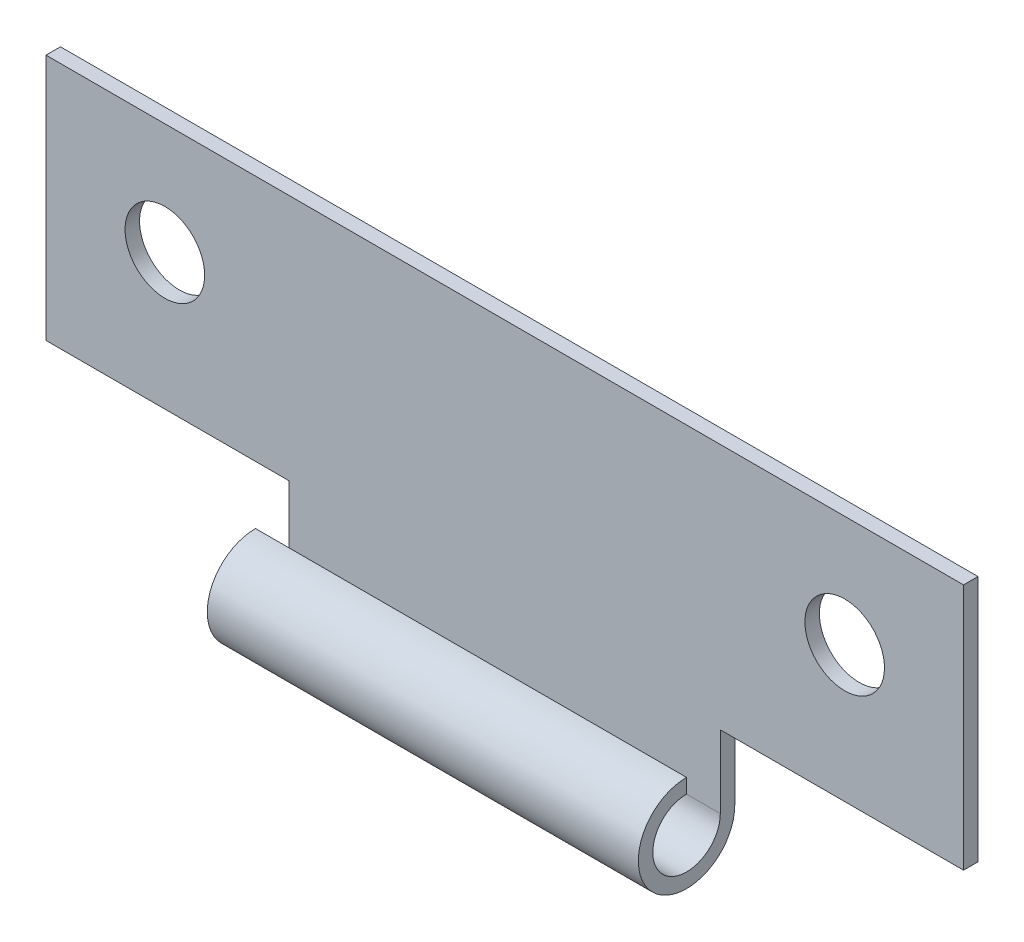
ISO-10303-21;
HEADER;
FILE_DESCRIPTION(('STEP AP214'),'2;1');
FILE_NAME('part.step','',(''),(''),'','','');
FILE_SCHEMA(('AUTOMOTIVE_DESIGN { 1 0 10303 214 1 1 1 1 }'));
ENDSEC;
DATA;
#1=APPLICATION_CONTEXT('core data for automotive mechanical design processes');
#2=APPLICATION_PROTOCOL_DEFINITION('international standard','automotive_design',2000,#1);
#3=PRODUCT_CONTEXT('',#1,'mechanical');
#4=PRODUCT('Part','Part','',(#3));
#5=PRODUCT_RELATED_PRODUCT_CATEGORY('part','',(#4));
#6=PRODUCT_DEFINITION_FORMATION('','',#4);
#7=PRODUCT_DEFINITION_CONTEXT('part definition',#1,'design');
#8=PRODUCT_DEFINITION('design','',#6,#7);
#9=PRODUCT_DEFINITION_SHAPE('','',#8);
#10=(LENGTH_UNIT() NAMED_UNIT(*) SI_UNIT(.MILLI.,.METRE.));
#11=(NAMED_UNIT(*) PLANE_ANGLE_UNIT() SI_UNIT($,.RADIAN.));
#12=(NAMED_UNIT(*) SI_UNIT($,.STERADIAN.) SOLID_ANGLE_UNIT());
#13=UNCERTAINTY_MEASURE_WITH_UNIT(LENGTH_MEASURE(1.E-05),#10,'distance_accuracy_value','');
#14=(GEOMETRIC_REPRESENTATION_CONTEXT(3) GLOBAL_UNCERTAINTY_ASSIGNED_CONTEXT((#13)) GLOBAL_UNIT_ASSIGNED_CONTEXT((#10,
#11,#12)) REPRESENTATION_CONTEXT('',''));
#15=CARTESIAN_POINT('',(0.,0.,0.));
#16=DIRECTION('',(0.,0.,1.));
#17=DIRECTION('',(1.,0.,0.));
#18=AXIS2_PLACEMENT_3D('',#15,#16,#17);
#19=CARTESIAN_POINT('',(0.,0.,0.));
#20=DIRECTION('',(0.,0.,1.));
#21=DIRECTION('',(1.,0.,0.));
#22=AXIS2_PLACEMENT_3D('',#19,#20,#21);
#23=PLANE('',#22);
#24=CARTESIAN_POINT('',(4.93000000000001,-4.62,0.));
#25=DIRECTION('',(0.,0.,1.));
#26=DIRECTION('',(1.,0.,0.));
#27=AXIS2_PLACEMENT_3D('',#24,#25,#26);
#28=CIRCLE('',#27,1.65);
#29=CARTESIAN_POINT('',(6.58000000000001,-4.62,0.));
#30=VERTEX_POINT('',#29);
#31=EDGE_CURVE('E141',#30,#30,#28,.T.);
#32=ORIENTED_EDGE('',*,*,#31,.T.);
#33=EDGE_LOOP('',(#32));
#34=FACE_BOUND('',#33,.T.);
#35=CARTESIAN_POINT('',(33.13,-4.62,0.));
#36=DIRECTION('',(0.,0.,1.));
#37=DIRECTION('',(1.,0.,0.));
#38=AXIS2_PLACEMENT_3D('',#35,#36,#37);
#39=CIRCLE('',#38,1.65);
#40=CARTESIAN_POINT('',(34.78,-4.62,0.));
#41=VERTEX_POINT('',#40);
#42=EDGE_CURVE('E135',#41,#41,#39,.T.);
#43=ORIENTED_EDGE('',*,*,#42,.T.);
#44=EDGE_LOOP('',(#43));
#45=FACE_BOUND('',#44,.T.);
#46=DIRECTION('',(1.,0.,0.));
#47=VECTOR('',#46,1.);
#48=CARTESIAN_POINT('',(10.09,-13.26,0.));
#49=LINE('',#48,#47);
#50=CARTESIAN_POINT('',(10.09,-13.26,0.));
#51=VERTEX_POINT('',#50);
#52=CARTESIAN_POINT('',(27.97,-13.26,0.));
#53=VERTEX_POINT('',#52);
#54=EDGE_CURVE('E114',#51,#53,#49,.T.);
#55=ORIENTED_EDGE('',*,*,#54,.F.);
#56=DIRECTION('',(0.,1.,0.));
#57=VECTOR('',#56,1.);
#58=CARTESIAN_POINT('',(10.09,-15.26,0.));
#59=LINE('',#58,#57);
#60=CARTESIAN_POINT('',(10.09,-10.25,0.));
#61=VERTEX_POINT('',#60);
#62=EDGE_CURVE('E124',#51,#61,#59,.T.);
#63=ORIENTED_EDGE('',*,*,#62,.T.);
#64=DIRECTION('',(1.,0.,0.));
#65=VECTOR('',#64,1.);
#66=CARTESIAN_POINT('',(0.,-10.25,0.));
#67=LINE('',#66,#65);
#68=CARTESIAN_POINT('',(0.,-10.25,0.));
#69=VERTEX_POINT('',#68);
#70=EDGE_CURVE('E165',#69,#61,#67,.T.);
#71=ORIENTED_EDGE('',*,*,#70,.F.);
#72=DIRECTION('',(0.,-1.,0.));
#73=VECTOR('',#72,1.);
#74=CARTESIAN_POINT('',(0.,0.,0.));
#75=LINE('',#74,#73);
#76=CARTESIAN_POINT('',(0.,0.,0.));
#77=VERTEX_POINT('',#76);
#78=EDGE_CURVE('E144',#77,#69,#75,.T.);
#79=ORIENTED_EDGE('',*,*,#78,.F.);
#80=DIRECTION('',(-1.,0.,0.));
#81=VECTOR('',#80,1.);
#82=CARTESIAN_POINT('',(0.,0.,0.));
#83=LINE('',#82,#81);
#84=CARTESIAN_POINT('',(38.06,0.,0.));
#85=VERTEX_POINT('',#84);
#86=EDGE_CURVE('E154',#85,#77,#83,.T.);
#87=ORIENTED_EDGE('',*,*,#86,.F.);
#88=DIRECTION('',(0.,1.,0.));
#89=VECTOR('',#88,1.);
#90=CARTESIAN_POINT('',(38.06,0.,0.));
#91=LINE('',#90,#89);
#92=CARTESIAN_POINT('',(38.06,-10.25,0.));
#93=VERTEX_POINT('',#92);
#94=EDGE_CURVE('E167',#93,#85,#91,.T.);
#95=ORIENTED_EDGE('',*,*,#94,.F.);
#96=CARTESIAN_POINT('',(27.97,-10.25,0.));
#97=VERTEX_POINT('',#96);
#98=EDGE_CURVE('E164',#97,#93,#67,.T.);
#99=ORIENTED_EDGE('',*,*,#98,.F.);
#100=DIRECTION('',(0.,1.,0.));
#101=VECTOR('',#100,1.);
#102=CARTESIAN_POINT('',(27.97,-15.26,0.));
#103=LINE('',#102,#101);
#104=EDGE_CURVE('E127',#53,#97,#103,.T.);
#105=ORIENTED_EDGE('',*,*,#104,.F.);
#106=EDGE_LOOP('',(#55,#63,#71,#79,#87,#95,#99,#105));
#107=FACE_BOUND('',#106,.T.);
#108=ADVANCED_FACE('F32',(#34,#45,#107),#23,.F.);
#109=CARTESIAN_POINT('',(10.09,-15.26,0.6));
#110=DIRECTION('',(1.,0.,0.));
#111=DIRECTION('',(0.,0.,-1.));
#112=AXIS2_PLACEMENT_3D('',#109,#110,#111);
#113=PLANE('',#112);
#114=ORIENTED_EDGE('',*,*,#62,.F.);
#115=CARTESIAN_POINT('',(10.09,-13.26,2.));
#116=DIRECTION('',(1.,0.,0.));
#117=DIRECTION('',(0.,0.,-1.));
#118=AXIS2_PLACEMENT_3D('',#115,#116,#117);
#119=CIRCLE('',#118,2.);
#120=CARTESIAN_POINT('',(10.09,-11.26,2.));
#121=VERTEX_POINT('',#120);
#122=EDGE_CURVE('E110',#121,#51,#119,.T.);
#123=ORIENTED_EDGE('',*,*,#122,.F.);
#124=DIRECTION('',(0.,1.,0.));
#125=VECTOR('',#124,1.);
#126=CARTESIAN_POINT('',(10.09,-11.86,2.));
#127=LINE('',#126,#125);
#128=CARTESIAN_POINT('',(10.09,-11.86,2.));
#129=VERTEX_POINT('',#128);
#130=EDGE_CURVE('E121',#129,#121,#127,.T.);
#131=ORIENTED_EDGE('',*,*,#130,.F.);
#132=CARTESIAN_POINT('',(10.09,-13.26,2.));
#133=DIRECTION('',(-1.,0.,0.));
#134=DIRECTION('',(0.,0.,-1.));
#135=AXIS2_PLACEMENT_3D('',#132,#133,#134);
#136=CIRCLE('',#135,1.4);
#137=CARTESIAN_POINT('',(10.09,-13.26,0.6));
#138=VERTEX_POINT('',#137);
#139=EDGE_CURVE('E211',#138,#129,#136,.T.);
#140=ORIENTED_EDGE('',*,*,#139,.F.);
#141=DIRECTION('',(0.,1.,0.));
#142=VECTOR('',#141,1.);
#143=CARTESIAN_POINT('',(10.09,-15.26,0.6));
#144=LINE('',#143,#142);
#145=CARTESIAN_POINT('',(10.09,-10.25,0.6));
#146=VERTEX_POINT('',#145);
#147=EDGE_CURVE('E47',#138,#146,#144,.T.);
#148=ORIENTED_EDGE('',*,*,#147,.T.);
#149=DIRECTION('',(0.,0.,-1.));
#150=VECTOR('',#149,1.);
#151=CARTESIAN_POINT('',(10.09,-10.25,0.6));
#152=LINE('',#151,#150);
#153=EDGE_CURVE('E131',#146,#61,#152,.T.);
#154=ORIENTED_EDGE('',*,*,#153,.T.);
#155=EDGE_LOOP('',(#114,#123,#131,#140,#148,#154));
#156=FACE_BOUND('',#155,.T.);
#157=ADVANCED_FACE('F130',(#156),#113,.F.);
#158=CARTESIAN_POINT('',(27.97,-15.26,0.6));
#159=DIRECTION('',(-1.,0.,0.));
#160=DIRECTION('',(0.,0.,1.));
#161=AXIS2_PLACEMENT_3D('',#158,#159,#160);
#162=PLANE('',#161);
#163=CARTESIAN_POINT('',(27.97,-13.26,2.));
#164=DIRECTION('',(1.,0.,0.));
#165=DIRECTION('',(0.,0.,-1.));
#166=AXIS2_PLACEMENT_3D('',#163,#164,#165);
#167=CIRCLE('',#166,2.);
#168=CARTESIAN_POINT('',(27.97,-11.26,2.));
#169=VERTEX_POINT('',#168);
#170=EDGE_CURVE('E209',#169,#53,#167,.T.);
#171=ORIENTED_EDGE('',*,*,#170,.T.);
#172=ORIENTED_EDGE('',*,*,#104,.T.);
#173=DIRECTION('',(0.,0.,1.));
#174=VECTOR('',#173,1.);
#175=CARTESIAN_POINT('',(27.97,-10.25,0.6));
#176=LINE('',#175,#174);
#177=CARTESIAN_POINT('',(27.97,-10.25,0.6));
#178=VERTEX_POINT('',#177);
#179=EDGE_CURVE('E197',#97,#178,#176,.T.);
#180=ORIENTED_EDGE('',*,*,#179,.T.);
#181=DIRECTION('',(0.,1.,0.));
#182=VECTOR('',#181,1.);
#183=CARTESIAN_POINT('',(27.97,-15.26,0.6));
#184=LINE('',#183,#182);
#185=CARTESIAN_POINT('',(27.97,-13.26,0.6));
#186=VERTEX_POINT('',#185);
#187=EDGE_CURVE('E137',#186,#178,#184,.T.);
#188=ORIENTED_EDGE('',*,*,#187,.F.);
#189=CARTESIAN_POINT('',(27.97,-13.26,2.));
#190=DIRECTION('',(-1.,0.,0.));
#191=DIRECTION('',(0.,0.,-1.));
#192=AXIS2_PLACEMENT_3D('',#189,#190,#191);
#193=CIRCLE('',#192,1.4);
#194=CARTESIAN_POINT('',(27.97,-11.86,2.));
#195=VERTEX_POINT('',#194);
#196=EDGE_CURVE('E128',#186,#195,#193,.T.);
#197=ORIENTED_EDGE('',*,*,#196,.T.);
#198=DIRECTION('',(0.,1.,0.));
#199=VECTOR('',#198,1.);
#200=CARTESIAN_POINT('',(27.97,-11.86,2.));
#201=LINE('',#200,#199);
#202=EDGE_CURVE('E212',#195,#169,#201,.T.);
#203=ORIENTED_EDGE('',*,*,#202,.T.);
#204=EDGE_LOOP('',(#171,#172,#180,#188,#197,#203));
#205=FACE_BOUND('',#204,.T.);
#206=ADVANCED_FACE('F199',(#205),#162,.F.);
#207=CARTESIAN_POINT('',(0.,0.,0.6));
#208=DIRECTION('',(0.,0.,1.));
#209=DIRECTION('',(1.,0.,0.));
#210=AXIS2_PLACEMENT_3D('',#207,#208,#209);
#211=PLANE('',#210);
#212=DIRECTION('',(1.,0.,0.));
#213=VECTOR('',#212,1.);
#214=CARTESIAN_POINT('',(10.09,-13.26,0.6));
#215=LINE('',#214,#213);
#216=EDGE_CURVE('E203',#138,#186,#215,.T.);
#217=ORIENTED_EDGE('',*,*,#216,.T.);
#218=ORIENTED_EDGE('',*,*,#187,.T.);
#219=DIRECTION('',(1.,0.,0.));
#220=VECTOR('',#219,1.);
#221=CARTESIAN_POINT('',(0.,-10.25,0.6));
#222=LINE('',#221,#220);
#223=CARTESIAN_POINT('',(38.06,-10.25,0.6));
#224=VERTEX_POINT('',#223);
#225=EDGE_CURVE('E153',#178,#224,#222,.T.);
#226=ORIENTED_EDGE('',*,*,#225,.T.);
#227=DIRECTION('',(0.,1.,0.));
#228=VECTOR('',#227,1.);
#229=CARTESIAN_POINT('',(38.06,0.,0.6));
#230=LINE('',#229,#228);
#231=CARTESIAN_POINT('',(38.06,0.,0.6));
#232=VERTEX_POINT('',#231);
#233=EDGE_CURVE('E157',#224,#232,#230,.T.);
#234=ORIENTED_EDGE('',*,*,#233,.T.);
#235=DIRECTION('',(-1.,0.,0.));
#236=VECTOR('',#235,1.);
#237=CARTESIAN_POINT('',(0.,0.,0.6));
#238=LINE('',#237,#236);
#239=CARTESIAN_POINT('',(0.,0.,0.6));
#240=VERTEX_POINT('',#239);
#241=EDGE_CURVE('E159',#232,#240,#238,.T.);
#242=ORIENTED_EDGE('',*,*,#241,.T.);
#243=DIRECTION('',(0.,-1.,0.));
#244=VECTOR('',#243,1.);
#245=CARTESIAN_POINT('',(0.,0.,0.6));
#246=LINE('',#245,#244);
#247=CARTESIAN_POINT('',(0.,-10.25,0.6));
#248=VERTEX_POINT('',#247);
#249=EDGE_CURVE('E150',#240,#248,#246,.T.);
#250=ORIENTED_EDGE('',*,*,#249,.T.);
#251=EDGE_CURVE('E155',#248,#146,#222,.T.);
#252=ORIENTED_EDGE('',*,*,#251,.T.);
#253=ORIENTED_EDGE('',*,*,#147,.F.);
#254=EDGE_LOOP('',(#217,#218,#226,#234,#242,#250,#252,#253));
#255=FACE_BOUND('',#254,.T.);
#256=CARTESIAN_POINT('',(4.93000000000001,-4.62,0.6));
#257=DIRECTION('',(0.,0.,1.));
#258=DIRECTION('',(1.,0.,0.));
#259=AXIS2_PLACEMENT_3D('',#256,#257,#258);
#260=CIRCLE('',#259,1.65);
#261=CARTESIAN_POINT('',(6.58000000000001,-4.62,0.6));
#262=VERTEX_POINT('',#261);
#263=EDGE_CURVE('E145',#262,#262,#260,.T.);
#264=ORIENTED_EDGE('',*,*,#263,.F.);
#265=EDGE_LOOP('',(#264));
#266=FACE_BOUND('',#265,.T.);
#267=CARTESIAN_POINT('',(33.13,-4.62,0.6));
#268=DIRECTION('',(0.,0.,1.));
#269=DIRECTION('',(1.,0.,0.));
#270=AXIS2_PLACEMENT_3D('',#267,#268,#269);
#271=CIRCLE('',#270,1.65);
#272=CARTESIAN_POINT('',(34.78,-4.62,0.6));
#273=VERTEX_POINT('',#272);
#274=EDGE_CURVE('E132',#273,#273,#271,.T.);
#275=ORIENTED_EDGE('',*,*,#274,.F.);
#276=EDGE_LOOP('',(#275));
#277=FACE_BOUND('',#276,.T.);
#278=ADVANCED_FACE('F192',(#255,#266,#277),#211,.T.);
#279=CARTESIAN_POINT('',(0.,-10.25,0.6));
#280=DIRECTION('',(0.,1.,0.));
#281=DIRECTION('',(0.,0.,1.));
#282=AXIS2_PLACEMENT_3D('',#279,#280,#281);
#283=PLANE('',#282);
#284=ORIENTED_EDGE('',*,*,#153,.F.);
#285=ORIENTED_EDGE('',*,*,#251,.F.);
#286=DIRECTION('',(0.,0.,-1.));
#287=VECTOR('',#286,1.);
#288=CARTESIAN_POINT('',(0.,-10.25,0.6));
#289=LINE('',#288,#287);
#290=EDGE_CURVE('E11',#248,#69,#289,.T.);
#291=ORIENTED_EDGE('',*,*,#290,.T.);
#292=ORIENTED_EDGE('',*,*,#70,.T.);
#293=EDGE_LOOP('',(#284,#285,#291,#292));
#294=FACE_BOUND('',#293,.T.);
#295=ADVANCED_FACE('F246',(#294),#283,.F.);
#296=ORIENTED_EDGE('',*,*,#179,.F.);
#297=ORIENTED_EDGE('',*,*,#98,.T.);
#298=DIRECTION('',(0.,0.,-1.));
#299=VECTOR('',#298,1.);
#300=CARTESIAN_POINT('',(38.06,-10.25,0.6));
#301=LINE('',#300,#299);
#302=EDGE_CURVE('E40',#224,#93,#301,.T.);
#303=ORIENTED_EDGE('',*,*,#302,.F.);
#304=ORIENTED_EDGE('',*,*,#225,.F.);
#305=EDGE_LOOP('',(#296,#297,#303,#304));
#306=FACE_BOUND('',#305,.T.);
#307=ADVANCED_FACE('F196',(#306),#283,.F.);
#308=CARTESIAN_POINT('',(0.,0.,0.6));
#309=DIRECTION('',(1.,0.,0.));
#310=DIRECTION('',(0.,1.,0.));
#311=AXIS2_PLACEMENT_3D('',#308,#309,#310);
#312=PLANE('',#311);
#313=ORIENTED_EDGE('',*,*,#78,.T.);
#314=ORIENTED_EDGE('',*,*,#290,.F.);
#315=ORIENTED_EDGE('',*,*,#249,.F.);
#316=DIRECTION('',(0.,0.,-1.));
#317=VECTOR('',#316,1.);
#318=CARTESIAN_POINT('',(0.,0.,0.6));
#319=LINE('',#318,#317);
#320=EDGE_CURVE('E161',#240,#77,#319,.T.);
#321=ORIENTED_EDGE('',*,*,#320,.T.);
#322=EDGE_LOOP('',(#313,#314,#315,#321));
#323=FACE_BOUND('',#322,.T.);
#324=ADVANCED_FACE('F34',(#323),#312,.F.);
#325=CARTESIAN_POINT('',(38.06,0.,0.6));
#326=DIRECTION('',(-1.,0.,0.));
#327=DIRECTION('',(0.,-1.,0.));
#328=AXIS2_PLACEMENT_3D('',#325,#326,#327);
#329=PLANE('',#328);
#330=ORIENTED_EDGE('',*,*,#94,.T.);
#331=DIRECTION('',(0.,0.,-1.));
#332=VECTOR('',#331,1.);
#333=CARTESIAN_POINT('',(38.06,0.,0.6));
#334=LINE('',#333,#332);
#335=EDGE_CURVE('E172',#232,#85,#334,.T.);
#336=ORIENTED_EDGE('',*,*,#335,.F.);
#337=ORIENTED_EDGE('',*,*,#233,.F.);
#338=ORIENTED_EDGE('',*,*,#302,.T.);
#339=EDGE_LOOP('',(#330,#336,#337,#338));
#340=FACE_BOUND('',#339,.T.);
#341=ADVANCED_FACE('F179',(#340),#329,.F.);
#342=CARTESIAN_POINT('',(0.,0.,0.6));
#343=DIRECTION('',(0.,-1.,0.));
#344=DIRECTION('',(0.,0.,-1.));
#345=AXIS2_PLACEMENT_3D('',#342,#343,#344);
#346=PLANE('',#345);
#347=ORIENTED_EDGE('',*,*,#86,.T.);
#348=ORIENTED_EDGE('',*,*,#320,.F.);
#349=ORIENTED_EDGE('',*,*,#241,.F.);
#350=ORIENTED_EDGE('',*,*,#335,.T.);
#351=EDGE_LOOP('',(#347,#348,#349,#350));
#352=FACE_BOUND('',#351,.T.);
#353=ADVANCED_FACE('F187',(#352),#346,.F.);
#354=CARTESIAN_POINT('',(33.13,-4.62,0.));
#355=DIRECTION('',(0.,0.,1.));
#356=DIRECTION('',(1.,0.,0.));
#357=AXIS2_PLACEMENT_3D('',#354,#355,#356);
#358=CYLINDRICAL_SURFACE('',#357,1.65);
#359=ORIENTED_EDGE('',*,*,#42,.F.);
#360=EDGE_LOOP('',(#359));
#361=FACE_BOUND('',#360,.T.);
#362=ORIENTED_EDGE('',*,*,#274,.T.);
#363=EDGE_LOOP('',(#362));
#364=FACE_BOUND('',#363,.T.);
#365=ADVANCED_FACE('F244',(#361,#364),#358,.F.);
#366=CARTESIAN_POINT('',(4.93000000000001,-4.62,0.));
#367=DIRECTION('',(0.,0.,1.));
#368=DIRECTION('',(1.,0.,0.));
#369=AXIS2_PLACEMENT_3D('',#366,#367,#368);
#370=CYLINDRICAL_SURFACE('',#369,1.65);
#371=ORIENTED_EDGE('',*,*,#31,.F.);
#372=EDGE_LOOP('',(#371));
#373=FACE_BOUND('',#372,.T.);
#374=ORIENTED_EDGE('',*,*,#263,.T.);
#375=EDGE_LOOP('',(#374));
#376=FACE_BOUND('',#375,.T.);
#377=ADVANCED_FACE('F260',(#373,#376),#370,.F.);
#378=CARTESIAN_POINT('',(10.09,-13.26,2.));
#379=DIRECTION('',(1.,0.,0.));
#380=DIRECTION('',(0.,0.,-1.));
#381=AXIS2_PLACEMENT_3D('',#378,#379,#380);
#382=CYLINDRICAL_SURFACE('',#381,1.4);
#383=ORIENTED_EDGE('',*,*,#196,.F.);
#384=ORIENTED_EDGE('',*,*,#216,.F.);
#385=ORIENTED_EDGE('',*,*,#139,.T.);
#386=DIRECTION('',(1.,0.,0.));
#387=VECTOR('',#386,1.);
#388=CARTESIAN_POINT('',(10.09,-11.86,2.));
#389=LINE('',#388,#387);
#390=EDGE_CURVE('E120',#129,#195,#389,.T.);
#391=ORIENTED_EDGE('',*,*,#390,.T.);
#392=EDGE_LOOP('',(#383,#384,#385,#391));
#393=FACE_BOUND('',#392,.T.);
#394=ADVANCED_FACE('F220',(#393),#382,.F.);
#395=CARTESIAN_POINT('',(10.09,-13.26,2.));
#396=DIRECTION('',(1.,0.,0.));
#397=DIRECTION('',(0.,0.,-1.));
#398=AXIS2_PLACEMENT_3D('',#395,#396,#397);
#399=CYLINDRICAL_SURFACE('',#398,2.);
#400=ORIENTED_EDGE('',*,*,#122,.T.);
#401=ORIENTED_EDGE('',*,*,#54,.T.);
#402=ORIENTED_EDGE('',*,*,#170,.F.);
#403=DIRECTION('',(1.,0.,0.));
#404=VECTOR('',#403,1.);
#405=CARTESIAN_POINT('',(10.09,-11.26,2.));
#406=LINE('',#405,#404);
#407=EDGE_CURVE('E116',#121,#169,#406,.T.);
#408=ORIENTED_EDGE('',*,*,#407,.F.);
#409=EDGE_LOOP('',(#400,#401,#402,#408));
#410=FACE_BOUND('',#409,.T.);
#411=ADVANCED_FACE('F112',(#410),#399,.T.);
#412=CARTESIAN_POINT('',(10.09,-11.86,2.));
#413=DIRECTION('',(0.,0.,-1.));
#414=DIRECTION('',(-1.,0.,0.));
#415=AXIS2_PLACEMENT_3D('',#412,#413,#414);
#416=PLANE('',#415);
#417=ORIENTED_EDGE('',*,*,#202,.F.);
#418=ORIENTED_EDGE('',*,*,#390,.F.);
#419=ORIENTED_EDGE('',*,*,#130,.T.);
#420=ORIENTED_EDGE('',*,*,#407,.T.);
#421=EDGE_LOOP('',(#417,#418,#419,#420));
#422=FACE_BOUND('',#421,.T.);
#423=ADVANCED_FACE('F223',(#422),#416,.T.);
#424=CLOSED_SHELL('',(#108,#157,#206,#278,#295,#307,#324,#341,#353,#365,#377,#394,#411,#423));
#425=MANIFOLD_SOLID_BREP('B2',#424);
#426=ADVANCED_BREP_SHAPE_REPRESENTATION('',(#18,#425),#14);
#427=SHAPE_DEFINITION_REPRESENTATION(#9,#426);
ENDSEC;
END-ISO-10303-21;
